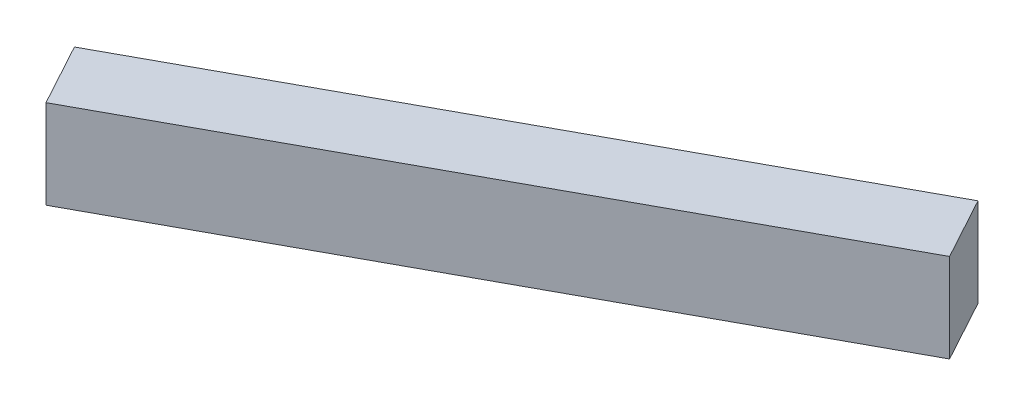
ISO-10303-21;
HEADER;
FILE_DESCRIPTION(('STEP AP214'),'2;1');
FILE_NAME('part.step','',(''),(''),'','','');
FILE_SCHEMA(('AUTOMOTIVE_DESIGN { 1 0 10303 214 1 1 1 1 }'));
ENDSEC;
DATA;
#1=APPLICATION_CONTEXT('core data for automotive mechanical design processes');
#2=APPLICATION_PROTOCOL_DEFINITION('international standard','automotive_design',2000,#1);
#3=PRODUCT_CONTEXT('',#1,'mechanical');
#4=PRODUCT('Part','Part','',(#3));
#5=PRODUCT_RELATED_PRODUCT_CATEGORY('part','',(#4));
#6=PRODUCT_DEFINITION_FORMATION('','',#4);
#7=PRODUCT_DEFINITION_CONTEXT('part definition',#1,'design');
#8=PRODUCT_DEFINITION('design','',#6,#7);
#9=PRODUCT_DEFINITION_SHAPE('','',#8);
#10=(LENGTH_UNIT() NAMED_UNIT(*) SI_UNIT(.MILLI.,.METRE.));
#11=(NAMED_UNIT(*) PLANE_ANGLE_UNIT() SI_UNIT($,.RADIAN.));
#12=(NAMED_UNIT(*) SI_UNIT($,.STERADIAN.) SOLID_ANGLE_UNIT());
#13=UNCERTAINTY_MEASURE_WITH_UNIT(LENGTH_MEASURE(1.E-05),#10,'distance_accuracy_value','');
#14=(GEOMETRIC_REPRESENTATION_CONTEXT(3) GLOBAL_UNCERTAINTY_ASSIGNED_CONTEXT((#13)) GLOBAL_UNIT_ASSIGNED_CONTEXT((#10,
#11,#12)) REPRESENTATION_CONTEXT('',''));
#15=CARTESIAN_POINT('',(0.,0.,0.));
#16=DIRECTION('',(0.,0.,1.));
#17=DIRECTION('',(1.,0.,0.));
#18=AXIS2_PLACEMENT_3D('',#15,#16,#17);
#19=CARTESIAN_POINT('',(15.7582217281463,7.874,-8.69552775692038));
#20=DIRECTION('',(0.478252518826224,0.,0.878222368330693));
#21=DIRECTION('',(0.878222368330693,0.,-0.478252518826224));
#22=AXIS2_PLACEMENT_3D('',#19,#20,#21);
#23=PLANE('',#22);
#24=DIRECTION('',(0.,1.,0.));
#25=VECTOR('',#24,1.);
#26=CARTESIAN_POINT('',(15.7582217281463,7.874,-8.69552775692038));
#27=LINE('',#26,#25);
#28=CARTESIAN_POINT('',(15.7582217281463,7.62,-8.69552775692038));
#29=VERTEX_POINT('',#28);
#30=CARTESIAN_POINT('',(15.7582217281463,7.874,-8.69552775692038));
#31=VERTEX_POINT('',#30);
#32=EDGE_CURVE('E20',#29,#31,#27,.T.);
#33=ORIENTED_EDGE('',*,*,#32,.T.);
#34=DIRECTION('',(0.878222368330685,0.,-0.47825251882624));
#35=VECTOR('',#34,1.);
#36=CARTESIAN_POINT('',(15.7582217281463,7.874,-8.69552775692038));
#37=LINE('',#36,#35);
#38=CARTESIAN_POINT('',(17.4312353398162,7.874,-9.60659880528433));
#39=VERTEX_POINT('',#38);
#40=EDGE_CURVE('E55',#31,#39,#37,.T.);
#41=ORIENTED_EDGE('',*,*,#40,.T.);
#42=DIRECTION('',(0.,1.,0.));
#43=VECTOR('',#42,1.);
#44=CARTESIAN_POINT('',(17.4312353398162,7.874,-9.60659880528434));
#45=LINE('',#44,#43);
#46=CARTESIAN_POINT('',(17.4312353398162,7.62,-9.60659880528433));
#47=VERTEX_POINT('',#46);
#48=EDGE_CURVE('E76',#39,#47,#45,.F.);
#49=ORIENTED_EDGE('',*,*,#48,.T.);
#50=DIRECTION('',(0.878222368330685,0.,-0.47825251882624));
#51=VECTOR('',#50,1.);
#52=CARTESIAN_POINT('',(15.7582217281463,7.62,-8.69552775692038));
#53=LINE('',#52,#51);
#54=EDGE_CURVE('E58',#29,#47,#53,.T.);
#55=ORIENTED_EDGE('',*,*,#54,.F.);
#56=EDGE_LOOP('',(#33,#41,#49,#55));
#57=FACE_BOUND('',#56,.T.);
#58=ADVANCED_FACE('F17',(#57),#23,.F.);
#59=CARTESIAN_POINT('',(15.7582217281463,7.874,-8.69552775692038));
#60=DIRECTION('',(0.878222368330698,0.,-0.478252518826216));
#61=DIRECTION('',(-0.478252518826216,0.,-0.878222368330698));
#62=AXIS2_PLACEMENT_3D('',#59,#60,#61);
#63=PLANE('',#62);
#64=DIRECTION('',(0.,1.,0.));
#65=VECTOR('',#64,1.);
#66=CARTESIAN_POINT('',(15.8554026399718,7.874,-8.51707297167559));
#67=LINE('',#66,#65);
#68=CARTESIAN_POINT('',(15.8554026399718,7.62,-8.51707297167559));
#69=VERTEX_POINT('',#68);
#70=CARTESIAN_POINT('',(15.8554026399718,7.874,-8.51707297167559));
#71=VERTEX_POINT('',#70);
#72=EDGE_CURVE('E73',#69,#71,#67,.T.);
#73=ORIENTED_EDGE('',*,*,#72,.T.);
#74=DIRECTION('',(-0.47825251882628,0.,-0.878222368330663));
#75=VECTOR('',#74,1.);
#76=CARTESIAN_POINT('',(15.8554026399718,7.874,-8.51707297167559));
#77=LINE('',#76,#75);
#78=EDGE_CURVE('E63',#71,#31,#77,.T.);
#79=ORIENTED_EDGE('',*,*,#78,.T.);
#80=ORIENTED_EDGE('',*,*,#32,.F.);
#81=DIRECTION('',(-0.47825251882628,0.,-0.878222368330663));
#82=VECTOR('',#81,1.);
#83=CARTESIAN_POINT('',(15.8554026399718,7.62,-8.51707297167559));
#84=LINE('',#83,#82);
#85=EDGE_CURVE('E80',#69,#29,#84,.T.);
#86=ORIENTED_EDGE('',*,*,#85,.F.);
#87=EDGE_LOOP('',(#73,#79,#80,#86));
#88=FACE_BOUND('',#87,.T.);
#89=ADVANCED_FACE('F72',(#88),#63,.F.);
#90=CARTESIAN_POINT('',(15.7582217281463,7.874,-8.69552775692038));
#91=DIRECTION('',(0.,-1.,0.));
#92=DIRECTION('',(0.,0.,-1.));
#93=AXIS2_PLACEMENT_3D('',#90,#91,#92);
#94=PLANE('',#93);
#95=ORIENTED_EDGE('',*,*,#78,.F.);
#96=DIRECTION('',(-0.878222368330694,0.,0.478252518826223));
#97=VECTOR('',#96,1.);
#98=CARTESIAN_POINT('',(15.8554026399718,7.874,-8.51707297167559));
#99=LINE('',#98,#97);
#100=CARTESIAN_POINT('',(17.5284162519134,7.874,-9.42814402018747));
#101=VERTEX_POINT('',#100);
#102=EDGE_CURVE('E83',#71,#101,#99,.F.);
#103=ORIENTED_EDGE('',*,*,#102,.T.);
#104=DIRECTION('',(0.478252520163176,0.,0.878222367602631));
#105=VECTOR('',#104,1.);
#106=CARTESIAN_POINT('',(17.4312353398162,7.874,-9.60659880528434));
#107=LINE('',#106,#105);
#108=EDGE_CURVE('E69',#101,#39,#107,.F.);
#109=ORIENTED_EDGE('',*,*,#108,.T.);
#110=ORIENTED_EDGE('',*,*,#40,.F.);
#111=EDGE_LOOP('',(#95,#103,#109,#110));
#112=FACE_BOUND('',#111,.T.);
#113=ADVANCED_FACE('F66',(#112),#94,.F.);
#114=CARTESIAN_POINT('',(17.4312353398162,7.874,-9.60659880528434));
#115=DIRECTION('',(-0.878222367602631,0.,0.478252520163176));
#116=DIRECTION('',(0.478252520163176,0.,0.878222367602631));
#117=AXIS2_PLACEMENT_3D('',#114,#115,#116);
#118=PLANE('',#117);
#119=ORIENTED_EDGE('',*,*,#48,.F.);
#120=ORIENTED_EDGE('',*,*,#108,.F.);
#121=DIRECTION('',(0.,1.,0.));
#122=VECTOR('',#121,1.);
#123=CARTESIAN_POINT('',(17.5284162519134,7.874,-9.42814402018747));
#124=LINE('',#123,#122);
#125=CARTESIAN_POINT('',(17.5284162519134,7.62,-9.42814402018747));
#126=VERTEX_POINT('',#125);
#127=EDGE_CURVE('E26',#101,#126,#124,.F.);
#128=ORIENTED_EDGE('',*,*,#127,.T.);
#129=DIRECTION('',(0.478252520163307,0.,0.87822236760256));
#130=VECTOR('',#129,1.);
#131=CARTESIAN_POINT('',(17.4312353398162,7.62,-9.60659880528434));
#132=LINE('',#131,#130);
#133=EDGE_CURVE('E34',#47,#126,#132,.T.);
#134=ORIENTED_EDGE('',*,*,#133,.F.);
#135=EDGE_LOOP('',(#119,#120,#128,#134));
#136=FACE_BOUND('',#135,.T.);
#137=ADVANCED_FACE('F88',(#136),#118,.F.);
#138=CARTESIAN_POINT('',(15.7582217281463,7.62,-8.69552775692038));
#139=DIRECTION('',(0.,-1.,0.));
#140=DIRECTION('',(0.,0.,-1.));
#141=AXIS2_PLACEMENT_3D('',#138,#139,#140);
#142=PLANE('',#141);
#143=DIRECTION('',(-0.878222368330694,0.,0.478252518826223));
#144=VECTOR('',#143,1.);
#145=CARTESIAN_POINT('',(15.8554026399718,7.62,-8.51707297167559));
#146=LINE('',#145,#144);
#147=EDGE_CURVE('E11',#126,#69,#146,.T.);
#148=ORIENTED_EDGE('',*,*,#147,.T.);
#149=ORIENTED_EDGE('',*,*,#85,.T.);
#150=ORIENTED_EDGE('',*,*,#54,.T.);
#151=ORIENTED_EDGE('',*,*,#133,.T.);
#152=EDGE_LOOP('',(#148,#149,#150,#151));
#153=FACE_BOUND('',#152,.T.);
#154=ADVANCED_FACE('F91',(#153),#142,.T.);
#155=CARTESIAN_POINT('',(15.8554026399718,7.874,-8.51707297167559));
#156=DIRECTION('',(-0.478252518826223,0.,-0.878222368330694));
#157=DIRECTION('',(-0.878222368330694,0.,0.478252518826223));
#158=AXIS2_PLACEMENT_3D('',#155,#156,#157);
#159=PLANE('',#158);
#160=ORIENTED_EDGE('',*,*,#127,.F.);
#161=ORIENTED_EDGE('',*,*,#102,.F.);
#162=ORIENTED_EDGE('',*,*,#72,.F.);
#163=ORIENTED_EDGE('',*,*,#147,.F.);
#164=EDGE_LOOP('',(#160,#161,#162,#163));
#165=FACE_BOUND('',#164,.T.);
#166=ADVANCED_FACE('F90',(#165),#159,.F.);
#167=CLOSED_SHELL('',(#58,#89,#113,#137,#154,#166));
#168=MANIFOLD_SOLID_BREP('B1',#167);
#169=ADVANCED_BREP_SHAPE_REPRESENTATION('',(#18,#168),#14);
#170=SHAPE_DEFINITION_REPRESENTATION(#9,#169);
ENDSEC;
END-ISO-10303-21;
